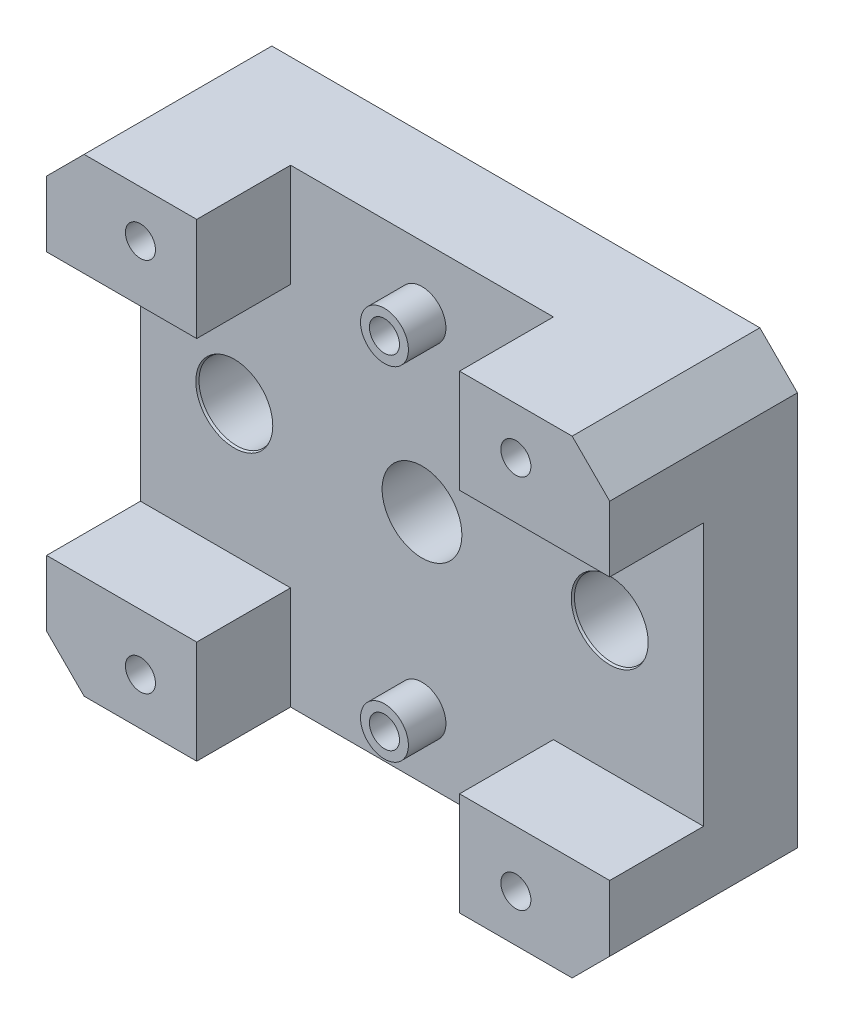
ISO-10303-21;
HEADER;
FILE_DESCRIPTION(('STEP AP214'),'2;1');
FILE_NAME('part.step','',(''),(''),'','','');
FILE_SCHEMA(('AUTOMOTIVE_DESIGN { 1 0 10303 214 1 1 1 1 }'));
ENDSEC;
DATA;
#1=APPLICATION_CONTEXT('core data for automotive mechanical design processes');
#2=APPLICATION_PROTOCOL_DEFINITION('international standard','automotive_design',2000,#1);
#3=PRODUCT_CONTEXT('',#1,'mechanical');
#4=PRODUCT('Part','Part','',(#3));
#5=PRODUCT_RELATED_PRODUCT_CATEGORY('part','',(#4));
#6=PRODUCT_DEFINITION_FORMATION('','',#4);
#7=PRODUCT_DEFINITION_CONTEXT('part definition',#1,'design');
#8=PRODUCT_DEFINITION('design','',#6,#7);
#9=PRODUCT_DEFINITION_SHAPE('','',#8);
#10=(LENGTH_UNIT() NAMED_UNIT(*) SI_UNIT(.MILLI.,.METRE.));
#11=(NAMED_UNIT(*) PLANE_ANGLE_UNIT() SI_UNIT($,.RADIAN.));
#12=(NAMED_UNIT(*) SI_UNIT($,.STERADIAN.) SOLID_ANGLE_UNIT());
#13=UNCERTAINTY_MEASURE_WITH_UNIT(LENGTH_MEASURE(1.E-05),#10,'distance_accuracy_value','');
#14=(GEOMETRIC_REPRESENTATION_CONTEXT(3) GLOBAL_UNCERTAINTY_ASSIGNED_CONTEXT((#13)) GLOBAL_UNIT_ASSIGNED_CONTEXT((#10,
#11,#12)) REPRESENTATION_CONTEXT('',''));
#15=CARTESIAN_POINT('',(0.,0.,0.));
#16=DIRECTION('',(0.,0.,1.));
#17=DIRECTION('',(1.,0.,0.));
#18=AXIS2_PLACEMENT_3D('',#15,#16,#17);
#19=CARTESIAN_POINT('',(0.,0.,0.));
#20=DIRECTION('',(0.,0.,-1.));
#21=DIRECTION('',(-1.,0.,0.));
#22=AXIS2_PLACEMENT_3D('',#19,#20,#21);
#23=PLANE('',#22);
#24=CARTESIAN_POINT('',(-20.,20.0000000000002,0.));
#25=DIRECTION('',(0.,0.,1.));
#26=DIRECTION('',(1.,0.,0.));
#27=AXIS2_PLACEMENT_3D('',#24,#25,#26);
#28=CIRCLE('',#27,1.60000000000001);
#29=CARTESIAN_POINT('',(-18.4,20.0000000000002,0.));
#30=VERTEX_POINT('',#29);
#31=EDGE_CURVE('E970',#30,#30,#28,.T.);
#32=ORIENTED_EDGE('',*,*,#31,.T.);
#33=EDGE_LOOP('',(#32));
#34=FACE_BOUND('',#33,.T.);
#35=CARTESIAN_POINT('',(20.,20.0000000000002,0.));
#36=DIRECTION('',(0.,0.,1.));
#37=DIRECTION('',(1.,0.,0.));
#38=AXIS2_PLACEMENT_3D('',#35,#36,#37);
#39=CIRCLE('',#38,1.60000000000001);
#40=CARTESIAN_POINT('',(21.6,20.0000000000002,0.));
#41=VERTEX_POINT('',#40);
#42=EDGE_CURVE('E964',#41,#41,#39,.T.);
#43=ORIENTED_EDGE('',*,*,#42,.T.);
#44=EDGE_LOOP('',(#43));
#45=FACE_BOUND('',#44,.T.);
#46=CARTESIAN_POINT('',(20.,-20.0000000000002,0.));
#47=DIRECTION('',(0.,0.,1.));
#48=DIRECTION('',(1.,0.,0.));
#49=AXIS2_PLACEMENT_3D('',#46,#47,#48);
#50=CIRCLE('',#49,1.60000000000001);
#51=CARTESIAN_POINT('',(21.6,-20.0000000000002,0.));
#52=VERTEX_POINT('',#51);
#53=EDGE_CURVE('E960',#52,#52,#50,.T.);
#54=ORIENTED_EDGE('',*,*,#53,.T.);
#55=EDGE_LOOP('',(#54));
#56=FACE_BOUND('',#55,.T.);
#57=DIRECTION('',(0.,1.,0.));
#58=VECTOR('',#57,1.);
#59=CARTESIAN_POINT('',(30.,-25.,0.));
#60=LINE('',#59,#58);
#61=CARTESIAN_POINT('',(30.,-21.,0.));
#62=VERTEX_POINT('',#61);
#63=CARTESIAN_POINT('',(30.,21.,0.));
#64=VERTEX_POINT('',#63);
#65=EDGE_CURVE('E386',#62,#64,#60,.T.);
#66=ORIENTED_EDGE('',*,*,#65,.F.);
#67=DIRECTION('',(0.707106781186548,0.707106781186547,0.));
#68=VECTOR('',#67,1.);
#69=CARTESIAN_POINT('',(25.5,-25.5,0.));
#70=LINE('',#69,#68);
#71=CARTESIAN_POINT('',(26.,-25.,0.));
#72=VERTEX_POINT('',#71);
#73=EDGE_CURVE('E435',#62,#72,#70,.F.);
#74=ORIENTED_EDGE('',*,*,#73,.T.);
#75=DIRECTION('',(1.,0.,0.));
#76=VECTOR('',#75,1.);
#77=CARTESIAN_POINT('',(-30.,-25.,0.));
#78=LINE('',#77,#76);
#79=CARTESIAN_POINT('',(-26.,-25.,0.));
#80=VERTEX_POINT('',#79);
#81=EDGE_CURVE('E391',#80,#72,#78,.T.);
#82=ORIENTED_EDGE('',*,*,#81,.F.);
#83=DIRECTION('',(0.707106781186547,-0.707106781186548,0.));
#84=VECTOR('',#83,1.);
#85=CARTESIAN_POINT('',(-25.5,-25.5,0.));
#86=LINE('',#85,#84);
#87=CARTESIAN_POINT('',(-30.,-21.,0.));
#88=VERTEX_POINT('',#87);
#89=EDGE_CURVE('E432',#80,#88,#86,.F.);
#90=ORIENTED_EDGE('',*,*,#89,.T.);
#91=DIRECTION('',(0.,-1.,0.));
#92=VECTOR('',#91,1.);
#93=CARTESIAN_POINT('',(-30.,-25.,0.));
#94=LINE('',#93,#92);
#95=CARTESIAN_POINT('',(-30.,21.,0.));
#96=VERTEX_POINT('',#95);
#97=EDGE_CURVE('E406',#96,#88,#94,.T.);
#98=ORIENTED_EDGE('',*,*,#97,.F.);
#99=DIRECTION('',(-0.707106781186548,-0.707106781186547,0.));
#100=VECTOR('',#99,1.);
#101=CARTESIAN_POINT('',(-25.5,25.5,0.));
#102=LINE('',#101,#100);
#103=CARTESIAN_POINT('',(-26.,25.,0.));
#104=VERTEX_POINT('',#103);
#105=EDGE_CURVE('E429',#96,#104,#102,.F.);
#106=ORIENTED_EDGE('',*,*,#105,.T.);
#107=DIRECTION('',(-1.,0.,0.));
#108=VECTOR('',#107,1.);
#109=CARTESIAN_POINT('',(-30.,25.,0.));
#110=LINE('',#109,#108);
#111=CARTESIAN_POINT('',(26.,25.,0.));
#112=VERTEX_POINT('',#111);
#113=EDGE_CURVE('E403',#112,#104,#110,.T.);
#114=ORIENTED_EDGE('',*,*,#113,.F.);
#115=DIRECTION('',(-0.707106781186546,0.707106781186549,0.));
#116=VECTOR('',#115,1.);
#117=CARTESIAN_POINT('',(25.5,25.5,0.));
#118=LINE('',#117,#116);
#119=EDGE_CURVE('E426',#112,#64,#118,.F.);
#120=ORIENTED_EDGE('',*,*,#119,.T.);
#121=EDGE_LOOP('',(#66,#74,#82,#90,#98,#106,#114,#120));
#122=FACE_BOUND('',#121,.T.);
#123=CARTESIAN_POINT('',(0.,0.,0.));
#124=DIRECTION('',(0.,0.,-1.));
#125=DIRECTION('',(-1.,0.,0.));
#126=AXIS2_PLACEMENT_3D('',#123,#124,#125);
#127=CIRCLE('',#126,4.25000000000001);
#128=CARTESIAN_POINT('',(-4.25000000000001,0.,0.));
#129=VERTEX_POINT('',#128);
#130=EDGE_CURVE('E382',#129,#129,#127,.T.);
#131=ORIENTED_EDGE('',*,*,#130,.F.);
#132=EDGE_LOOP('',(#131));
#133=FACE_BOUND('',#132,.T.);
#134=CARTESIAN_POINT('',(-20.,0.,0.));
#135=DIRECTION('',(0.,0.,1.));
#136=DIRECTION('',(1.,0.,0.));
#137=AXIS2_PLACEMENT_3D('',#134,#135,#136);
#138=CIRCLE('',#137,4.);
#139=CARTESIAN_POINT('',(-16.,0.,0.));
#140=VERTEX_POINT('',#139);
#141=EDGE_CURVE('E374',#140,#140,#138,.T.);
#142=ORIENTED_EDGE('',*,*,#141,.T.);
#143=EDGE_LOOP('',(#142));
#144=FACE_BOUND('',#143,.T.);
#145=CARTESIAN_POINT('',(20.,0.,0.));
#146=DIRECTION('',(0.,0.,1.));
#147=DIRECTION('',(1.,0.,0.));
#148=AXIS2_PLACEMENT_3D('',#145,#146,#147);
#149=CIRCLE('',#148,4.);
#150=CARTESIAN_POINT('',(24.,0.,0.));
#151=VERTEX_POINT('',#150);
#152=EDGE_CURVE('E362',#151,#151,#149,.T.);
#153=ORIENTED_EDGE('',*,*,#152,.T.);
#154=EDGE_LOOP('',(#153));
#155=FACE_BOUND('',#154,.T.);
#156=CARTESIAN_POINT('',(0.,-18.25,0.));
#157=DIRECTION('',(0.,0.,1.));
#158=DIRECTION('',(1.,0.,0.));
#159=AXIS2_PLACEMENT_3D('',#156,#157,#158);
#160=CIRCLE('',#159,1.60000000000001);
#161=CARTESIAN_POINT('',(1.60000000000001,-18.25,0.));
#162=VERTEX_POINT('',#161);
#163=EDGE_CURVE('E342',#162,#162,#160,.T.);
#164=ORIENTED_EDGE('',*,*,#163,.T.);
#165=EDGE_LOOP('',(#164));
#166=FACE_BOUND('',#165,.T.);
#167=CARTESIAN_POINT('',(0.,18.25,0.));
#168=DIRECTION('',(0.,0.,1.));
#169=DIRECTION('',(1.,0.,0.));
#170=AXIS2_PLACEMENT_3D('',#167,#168,#169);
#171=CIRCLE('',#170,1.60000000000001);
#172=CARTESIAN_POINT('',(1.60000000000001,18.25,0.));
#173=VERTEX_POINT('',#172);
#174=EDGE_CURVE('E334',#173,#173,#171,.T.);
#175=ORIENTED_EDGE('',*,*,#174,.T.);
#176=EDGE_LOOP('',(#175));
#177=FACE_BOUND('',#176,.T.);
#178=CARTESIAN_POINT('',(-20.,-20.0000000000002,0.));
#179=DIRECTION('',(0.,0.,1.));
#180=DIRECTION('',(1.,0.,0.));
#181=AXIS2_PLACEMENT_3D('',#178,#179,#180);
#182=CIRCLE('',#181,1.60000000000001);
#183=CARTESIAN_POINT('',(-18.4,-20.0000000000002,0.));
#184=VERTEX_POINT('',#183);
#185=EDGE_CURVE('E516',#184,#184,#182,.T.);
#186=ORIENTED_EDGE('',*,*,#185,.T.);
#187=EDGE_LOOP('',(#186));
#188=FACE_BOUND('',#187,.T.);
#189=ADVANCED_FACE('F43',(#34,#45,#56,#122,#133,#144,#155,#166,#177,#188),#23,.T.);
#190=CARTESIAN_POINT('',(0.,0.,10.));
#191=DIRECTION('',(0.,0.,-1.));
#192=DIRECTION('',(-1.,0.,0.));
#193=AXIS2_PLACEMENT_3D('',#190,#191,#192);
#194=PLANE('',#193);
#195=CARTESIAN_POINT('',(0.,-18.25,10.));
#196=DIRECTION('',(0.,0.,-1.));
#197=DIRECTION('',(-1.,0.,0.));
#198=AXIS2_PLACEMENT_3D('',#195,#196,#197);
#199=CIRCLE('',#198,2.55);
#200=CARTESIAN_POINT('',(-2.55,-18.25,10.));
#201=VERTEX_POINT('',#200);
#202=EDGE_CURVE('E415',#201,#201,#199,.F.);
#203=ORIENTED_EDGE('',*,*,#202,.F.);
#204=EDGE_LOOP('',(#203));
#205=FACE_BOUND('',#204,.T.);
#206=CARTESIAN_POINT('',(0.,18.25,10.));
#207=DIRECTION('',(0.,0.,-1.));
#208=DIRECTION('',(-1.,0.,0.));
#209=AXIS2_PLACEMENT_3D('',#206,#207,#208);
#210=CIRCLE('',#209,2.55);
#211=CARTESIAN_POINT('',(-2.55,18.25,10.));
#212=VERTEX_POINT('',#211);
#213=EDGE_CURVE('E399',#212,#212,#210,.F.);
#214=ORIENTED_EDGE('',*,*,#213,.F.);
#215=EDGE_LOOP('',(#214));
#216=FACE_BOUND('',#215,.T.);
#217=CARTESIAN_POINT('',(20.,0.,10.));
#218=DIRECTION('',(0.,0.,1.));
#219=DIRECTION('',(1.,0.,0.));
#220=AXIS2_PLACEMENT_3D('',#217,#218,#219);
#221=CIRCLE('',#220,4.1);
#222=CARTESIAN_POINT('',(24.1,0.,10.));
#223=VERTEX_POINT('',#222);
#224=EDGE_CURVE('E354',#223,#223,#221,.T.);
#225=ORIENTED_EDGE('',*,*,#224,.F.);
#226=EDGE_LOOP('',(#225));
#227=FACE_BOUND('',#226,.T.);
#228=CARTESIAN_POINT('',(-20.,0.,10.));
#229=DIRECTION('',(0.,0.,1.));
#230=DIRECTION('',(1.,0.,0.));
#231=AXIS2_PLACEMENT_3D('',#228,#229,#230);
#232=CIRCLE('',#231,4.1);
#233=CARTESIAN_POINT('',(-15.9,0.,10.));
#234=VERTEX_POINT('',#233);
#235=EDGE_CURVE('E366',#234,#234,#232,.T.);
#236=ORIENTED_EDGE('',*,*,#235,.F.);
#237=EDGE_LOOP('',(#236));
#238=FACE_BOUND('',#237,.T.);
#239=CARTESIAN_POINT('',(0.,0.,10.));
#240=DIRECTION('',(0.,0.,1.));
#241=DIRECTION('',(1.,0.,0.));
#242=AXIS2_PLACEMENT_3D('',#239,#240,#241);
#243=CIRCLE('',#242,4.25000000000002);
#244=CARTESIAN_POINT('',(4.25000000000002,0.,10.));
#245=VERTEX_POINT('',#244);
#246=EDGE_CURVE('E378',#245,#245,#243,.T.);
#247=ORIENTED_EDGE('',*,*,#246,.F.);
#248=EDGE_LOOP('',(#247));
#249=FACE_BOUND('',#248,.T.);
#250=DIRECTION('',(0.,1.,0.));
#251=VECTOR('',#250,1.);
#252=CARTESIAN_POINT('',(-14.0026876195789,0.,10.));
#253=LINE('',#252,#251);
#254=CARTESIAN_POINT('',(-14.0026876195789,-25.,10.));
#255=VERTEX_POINT('',#254);
#256=CARTESIAN_POINT('',(-14.0026876195789,-14.002687619579,10.));
#257=VERTEX_POINT('',#256);
#258=EDGE_CURVE('E513',#255,#257,#253,.T.);
#259=ORIENTED_EDGE('',*,*,#258,.F.);
#260=DIRECTION('',(1.,0.,0.));
#261=VECTOR('',#260,1.);
#262=CARTESIAN_POINT('',(-30.,-25.,10.));
#263=LINE('',#262,#261);
#264=CARTESIAN_POINT('',(14.0026876195789,-25.,10.));
#265=VERTEX_POINT('',#264);
#266=EDGE_CURVE('E213',#255,#265,#263,.T.);
#267=ORIENTED_EDGE('',*,*,#266,.T.);
#268=DIRECTION('',(0.,1.,0.));
#269=VECTOR('',#268,1.);
#270=CARTESIAN_POINT('',(14.0026876195789,0.,10.));
#271=LINE('',#270,#269);
#272=CARTESIAN_POINT('',(14.0026876195789,-14.002687619579,10.));
#273=VERTEX_POINT('',#272);
#274=EDGE_CURVE('E221',#265,#273,#271,.T.);
#275=ORIENTED_EDGE('',*,*,#274,.T.);
#276=DIRECTION('',(-1.,0.,0.));
#277=VECTOR('',#276,1.);
#278=CARTESIAN_POINT('',(0.,-14.002687619579,10.));
#279=LINE('',#278,#277);
#280=CARTESIAN_POINT('',(30.,-14.002687619579,10.));
#281=VERTEX_POINT('',#280);
#282=EDGE_CURVE('E216',#281,#273,#279,.T.);
#283=ORIENTED_EDGE('',*,*,#282,.F.);
#284=DIRECTION('',(0.,1.,0.));
#285=VECTOR('',#284,1.);
#286=CARTESIAN_POINT('',(30.,-25.,10.));
#287=LINE('',#286,#285);
#288=CARTESIAN_POINT('',(30.,14.002687619579,10.));
#289=VERTEX_POINT('',#288);
#290=EDGE_CURVE('E387',#281,#289,#287,.T.);
#291=ORIENTED_EDGE('',*,*,#290,.T.);
#292=DIRECTION('',(-1.,0.,0.));
#293=VECTOR('',#292,1.);
#294=CARTESIAN_POINT('',(0.,14.002687619579,10.));
#295=LINE('',#294,#293);
#296=CARTESIAN_POINT('',(14.0026876195789,14.002687619579,10.));
#297=VERTEX_POINT('',#296);
#298=EDGE_CURVE('E263',#289,#297,#295,.T.);
#299=ORIENTED_EDGE('',*,*,#298,.T.);
#300=DIRECTION('',(0.,-1.,0.));
#301=VECTOR('',#300,1.);
#302=CARTESIAN_POINT('',(14.0026876195789,0.,10.));
#303=LINE('',#302,#301);
#304=CARTESIAN_POINT('',(14.0026876195789,25.,10.));
#305=VERTEX_POINT('',#304);
#306=EDGE_CURVE('E258',#305,#297,#303,.T.);
#307=ORIENTED_EDGE('',*,*,#306,.F.);
#308=DIRECTION('',(-1.,0.,0.));
#309=VECTOR('',#308,1.);
#310=CARTESIAN_POINT('',(-30.,25.,10.));
#311=LINE('',#310,#309);
#312=CARTESIAN_POINT('',(-14.0026876195789,25.,10.));
#313=VERTEX_POINT('',#312);
#314=EDGE_CURVE('E390',#305,#313,#311,.T.);
#315=ORIENTED_EDGE('',*,*,#314,.T.);
#316=DIRECTION('',(0.,-1.,0.));
#317=VECTOR('',#316,1.);
#318=CARTESIAN_POINT('',(-14.0026876195789,0.,10.));
#319=LINE('',#318,#317);
#320=CARTESIAN_POINT('',(-14.0026876195789,14.0026876195791,10.));
#321=VERTEX_POINT('',#320);
#322=EDGE_CURVE('E294',#313,#321,#319,.T.);
#323=ORIENTED_EDGE('',*,*,#322,.T.);
#324=DIRECTION('',(1.,0.,0.));
#325=VECTOR('',#324,1.);
#326=CARTESIAN_POINT('',(0.,14.0026876195791,10.));
#327=LINE('',#326,#325);
#328=CARTESIAN_POINT('',(-30.,14.002687619579,10.));
#329=VERTEX_POINT('',#328);
#330=EDGE_CURVE('E300',#329,#321,#327,.T.);
#331=ORIENTED_EDGE('',*,*,#330,.F.);
#332=DIRECTION('',(0.,-1.,0.));
#333=VECTOR('',#332,1.);
#334=CARTESIAN_POINT('',(-30.,-25.,10.));
#335=LINE('',#334,#333);
#336=CARTESIAN_POINT('',(-30.,-14.002687619579,10.));
#337=VERTEX_POINT('',#336);
#338=EDGE_CURVE('E394',#329,#337,#335,.T.);
#339=ORIENTED_EDGE('',*,*,#338,.T.);
#340=DIRECTION('',(1.,0.,0.));
#341=VECTOR('',#340,1.);
#342=CARTESIAN_POINT('',(0.,-14.002687619579,10.));
#343=LINE('',#342,#341);
#344=EDGE_CURVE('E197',#337,#257,#343,.T.);
#345=ORIENTED_EDGE('',*,*,#344,.T.);
#346=EDGE_LOOP('',(#259,#267,#275,#283,#291,#299,#307,#315,#323,#331,#339,#345));
#347=FACE_BOUND('',#346,.T.);
#348=ADVANCED_FACE('F523',(#205,#216,#227,#238,#249,#347),#194,.F.);
#349=CARTESIAN_POINT('',(30.,-25.,10.));
#350=DIRECTION('',(-1.,0.,0.));
#351=DIRECTION('',(0.,0.,1.));
#352=AXIS2_PLACEMENT_3D('',#349,#350,#351);
#353=PLANE('',#352);
#354=DIRECTION('',(0.,1.,0.));
#355=VECTOR('',#354,1.);
#356=CARTESIAN_POINT('',(30.,0.,20.));
#357=LINE('',#356,#355);
#358=CARTESIAN_POINT('',(30.,-21.,20.));
#359=VERTEX_POINT('',#358);
#360=CARTESIAN_POINT('',(30.,-14.002687619579,20.));
#361=VERTEX_POINT('',#360);
#362=EDGE_CURVE('E231',#359,#361,#357,.T.);
#363=ORIENTED_EDGE('',*,*,#362,.F.);
#364=DIRECTION('',(0.,0.,-1.));
#365=VECTOR('',#364,1.);
#366=CARTESIAN_POINT('',(30.,-21.,10.));
#367=LINE('',#366,#365);
#368=EDGE_CURVE('E422',#359,#62,#367,.T.);
#369=ORIENTED_EDGE('',*,*,#368,.T.);
#370=ORIENTED_EDGE('',*,*,#65,.T.);
#371=DIRECTION('',(0.,0.,1.));
#372=VECTOR('',#371,1.);
#373=CARTESIAN_POINT('',(30.,21.,10.));
#374=LINE('',#373,#372);
#375=CARTESIAN_POINT('',(30.,21.,20.));
#376=VERTEX_POINT('',#375);
#377=EDGE_CURVE('E419',#64,#376,#374,.T.);
#378=ORIENTED_EDGE('',*,*,#377,.T.);
#379=DIRECTION('',(0.,1.,0.));
#380=VECTOR('',#379,1.);
#381=CARTESIAN_POINT('',(30.,0.,20.));
#382=LINE('',#381,#380);
#383=CARTESIAN_POINT('',(30.,14.002687619579,20.));
#384=VERTEX_POINT('',#383);
#385=EDGE_CURVE('E270',#384,#376,#382,.T.);
#386=ORIENTED_EDGE('',*,*,#385,.F.);
#387=DIRECTION('',(0.,0.,-1.));
#388=VECTOR('',#387,1.);
#389=CARTESIAN_POINT('',(30.,14.002687619579,20.));
#390=LINE('',#389,#388);
#391=EDGE_CURVE('E277',#384,#289,#390,.T.);
#392=ORIENTED_EDGE('',*,*,#391,.T.);
#393=ORIENTED_EDGE('',*,*,#290,.F.);
#394=DIRECTION('',(0.,0.,-1.));
#395=VECTOR('',#394,1.);
#396=CARTESIAN_POINT('',(30.,-14.002687619579,20.));
#397=LINE('',#396,#395);
#398=EDGE_CURVE('E254',#361,#281,#397,.T.);
#399=ORIENTED_EDGE('',*,*,#398,.F.);
#400=EDGE_LOOP('',(#363,#369,#370,#378,#386,#392,#393,#399));
#401=FACE_BOUND('',#400,.T.);
#402=ADVANCED_FACE('F488',(#401),#353,.F.);
#403=CARTESIAN_POINT('',(-30.,25.,10.));
#404=DIRECTION('',(0.,-1.,0.));
#405=DIRECTION('',(0.,0.,-1.));
#406=AXIS2_PLACEMENT_3D('',#403,#404,#405);
#407=PLANE('',#406);
#408=ORIENTED_EDGE('',*,*,#113,.T.);
#409=DIRECTION('',(0.,0.,1.));
#410=VECTOR('',#409,1.);
#411=CARTESIAN_POINT('',(-26.,25.,10.));
#412=LINE('',#411,#410);
#413=CARTESIAN_POINT('',(-26.,25.,20.));
#414=VERTEX_POINT('',#413);
#415=EDGE_CURVE('E66',#104,#414,#412,.T.);
#416=ORIENTED_EDGE('',*,*,#415,.T.);
#417=DIRECTION('',(-1.,0.,0.));
#418=VECTOR('',#417,1.);
#419=CARTESIAN_POINT('',(0.,25.,20.));
#420=LINE('',#419,#418);
#421=CARTESIAN_POINT('',(-14.0026876195789,25.,20.));
#422=VERTEX_POINT('',#421);
#423=EDGE_CURVE('E299',#422,#414,#420,.T.);
#424=ORIENTED_EDGE('',*,*,#423,.F.);
#425=DIRECTION('',(0.,0.,-1.));
#426=VECTOR('',#425,1.);
#427=CARTESIAN_POINT('',(-14.0026876195789,25.,20.));
#428=LINE('',#427,#426);
#429=EDGE_CURVE('E326',#422,#313,#428,.T.);
#430=ORIENTED_EDGE('',*,*,#429,.T.);
#431=ORIENTED_EDGE('',*,*,#314,.F.);
#432=DIRECTION('',(0.,0.,-1.));
#433=VECTOR('',#432,1.);
#434=CARTESIAN_POINT('',(14.0026876195789,25.,20.));
#435=LINE('',#434,#433);
#436=CARTESIAN_POINT('',(14.0026876195789,25.,20.));
#437=VERTEX_POINT('',#436);
#438=EDGE_CURVE('E290',#437,#305,#435,.T.);
#439=ORIENTED_EDGE('',*,*,#438,.F.);
#440=DIRECTION('',(-1.,0.,0.));
#441=VECTOR('',#440,1.);
#442=CARTESIAN_POINT('',(0.,25.,20.));
#443=LINE('',#442,#441);
#444=CARTESIAN_POINT('',(26.,25.,20.));
#445=VERTEX_POINT('',#444);
#446=EDGE_CURVE('E259',#445,#437,#443,.T.);
#447=ORIENTED_EDGE('',*,*,#446,.F.);
#448=DIRECTION('',(0.,0.,-1.));
#449=VECTOR('',#448,1.);
#450=CARTESIAN_POINT('',(26.,25.,10.));
#451=LINE('',#450,#449);
#452=EDGE_CURVE('E456',#445,#112,#451,.T.);
#453=ORIENTED_EDGE('',*,*,#452,.T.);
#454=EDGE_LOOP('',(#408,#416,#424,#430,#431,#439,#447,#453));
#455=FACE_BOUND('',#454,.T.);
#456=ADVANCED_FACE('F481',(#455),#407,.F.);
#457=CARTESIAN_POINT('',(-30.,-25.,10.));
#458=DIRECTION('',(1.,0.,0.));
#459=DIRECTION('',(0.,0.,-1.));
#460=AXIS2_PLACEMENT_3D('',#457,#458,#459);
#461=PLANE('',#460);
#462=ORIENTED_EDGE('',*,*,#97,.T.);
#463=DIRECTION('',(0.,0.,1.));
#464=VECTOR('',#463,1.);
#465=CARTESIAN_POINT('',(-30.,-21.,10.));
#466=LINE('',#465,#464);
#467=CARTESIAN_POINT('',(-30.,-21.,20.));
#468=VERTEX_POINT('',#467);
#469=EDGE_CURVE('E451',#88,#468,#466,.T.);
#470=ORIENTED_EDGE('',*,*,#469,.T.);
#471=DIRECTION('',(0.,-1.,0.));
#472=VECTOR('',#471,1.);
#473=CARTESIAN_POINT('',(-30.,0.,20.));
#474=LINE('',#473,#472);
#475=CARTESIAN_POINT('',(-30.,-14.002687619579,20.));
#476=VERTEX_POINT('',#475);
#477=EDGE_CURVE('E503',#476,#468,#474,.T.);
#478=ORIENTED_EDGE('',*,*,#477,.F.);
#479=DIRECTION('',(0.,0.,-1.));
#480=VECTOR('',#479,1.);
#481=CARTESIAN_POINT('',(-30.,-14.002687619579,20.));
#482=LINE('',#481,#480);
#483=EDGE_CURVE('E223',#476,#337,#482,.T.);
#484=ORIENTED_EDGE('',*,*,#483,.T.);
#485=ORIENTED_EDGE('',*,*,#338,.F.);
#486=DIRECTION('',(0.,0.,-1.));
#487=VECTOR('',#486,1.);
#488=CARTESIAN_POINT('',(-30.,14.002687619579,20.));
#489=LINE('',#488,#487);
#490=CARTESIAN_POINT('',(-30.,14.002687619579,20.));
#491=VERTEX_POINT('',#490);
#492=EDGE_CURVE('E322',#491,#329,#489,.T.);
#493=ORIENTED_EDGE('',*,*,#492,.F.);
#494=DIRECTION('',(0.,-1.,0.));
#495=VECTOR('',#494,1.);
#496=CARTESIAN_POINT('',(-30.,0.,20.));
#497=LINE('',#496,#495);
#498=CARTESIAN_POINT('',(-30.,21.,20.));
#499=VERTEX_POINT('',#498);
#500=EDGE_CURVE('E303',#499,#491,#497,.T.);
#501=ORIENTED_EDGE('',*,*,#500,.F.);
#502=DIRECTION('',(0.,0.,-1.));
#503=VECTOR('',#502,1.);
#504=CARTESIAN_POINT('',(-30.,21.,10.));
#505=LINE('',#504,#503);
#506=EDGE_CURVE('E447',#499,#96,#505,.T.);
#507=ORIENTED_EDGE('',*,*,#506,.T.);
#508=EDGE_LOOP('',(#462,#470,#478,#484,#485,#493,#501,#507));
#509=FACE_BOUND('',#508,.T.);
#510=ADVANCED_FACE('F472',(#509),#461,.F.);
#511=CARTESIAN_POINT('',(-30.,-25.,10.));
#512=DIRECTION('',(0.,1.,0.));
#513=DIRECTION('',(0.,0.,1.));
#514=AXIS2_PLACEMENT_3D('',#511,#512,#513);
#515=PLANE('',#514);
#516=ORIENTED_EDGE('',*,*,#81,.T.);
#517=DIRECTION('',(0.,0.,1.));
#518=VECTOR('',#517,1.);
#519=CARTESIAN_POINT('',(26.,-25.,10.));
#520=LINE('',#519,#518);
#521=CARTESIAN_POINT('',(26.,-25.,20.));
#522=VERTEX_POINT('',#521);
#523=EDGE_CURVE('E441',#72,#522,#520,.T.);
#524=ORIENTED_EDGE('',*,*,#523,.T.);
#525=DIRECTION('',(1.,0.,0.));
#526=VECTOR('',#525,1.);
#527=CARTESIAN_POINT('',(0.,-25.,20.));
#528=LINE('',#527,#526);
#529=CARTESIAN_POINT('',(14.0026876195789,-25.,20.));
#530=VERTEX_POINT('',#529);
#531=EDGE_CURVE('E241',#530,#522,#528,.T.);
#532=ORIENTED_EDGE('',*,*,#531,.F.);
#533=DIRECTION('',(0.,0.,-1.));
#534=VECTOR('',#533,1.);
#535=CARTESIAN_POINT('',(14.0026876195789,-25.,20.));
#536=LINE('',#535,#534);
#537=EDGE_CURVE('E244',#530,#265,#536,.T.);
#538=ORIENTED_EDGE('',*,*,#537,.T.);
#539=ORIENTED_EDGE('',*,*,#266,.F.);
#540=DIRECTION('',(0.,0.,-1.));
#541=VECTOR('',#540,1.);
#542=CARTESIAN_POINT('',(-14.0026876195789,-25.,20.));
#543=LINE('',#542,#541);
#544=CARTESIAN_POINT('',(-14.0026876195789,-25.,20.));
#545=VERTEX_POINT('',#544);
#546=EDGE_CURVE('E203',#545,#255,#543,.T.);
#547=ORIENTED_EDGE('',*,*,#546,.F.);
#548=DIRECTION('',(1.,0.,0.));
#549=VECTOR('',#548,1.);
#550=CARTESIAN_POINT('',(0.,-25.,20.));
#551=LINE('',#550,#549);
#552=CARTESIAN_POINT('',(-26.,-25.,20.));
#553=VERTEX_POINT('',#552);
#554=EDGE_CURVE('E182',#553,#545,#551,.T.);
#555=ORIENTED_EDGE('',*,*,#554,.F.);
#556=DIRECTION('',(0.,0.,-1.));
#557=VECTOR('',#556,1.);
#558=CARTESIAN_POINT('',(-26.,-25.,10.));
#559=LINE('',#558,#557);
#560=EDGE_CURVE('E438',#553,#80,#559,.T.);
#561=ORIENTED_EDGE('',*,*,#560,.T.);
#562=EDGE_LOOP('',(#516,#524,#532,#538,#539,#547,#555,#561));
#563=FACE_BOUND('',#562,.T.);
#564=ADVANCED_FACE('F211',(#563),#515,.F.);
#565=CARTESIAN_POINT('',(0.,0.,10.));
#566=DIRECTION('',(0.,0.,1.));
#567=DIRECTION('',(1.,0.,0.));
#568=AXIS2_PLACEMENT_3D('',#565,#566,#567);
#569=CYLINDRICAL_SURFACE('',#568,4.25000000000001);
#570=ORIENTED_EDGE('',*,*,#130,.T.);
#571=EDGE_LOOP('',(#570));
#572=FACE_BOUND('',#571,.T.);
#573=ORIENTED_EDGE('',*,*,#246,.T.);
#574=EDGE_LOOP('',(#573));
#575=FACE_BOUND('',#574,.T.);
#576=ADVANCED_FACE('F577',(#572,#575),#569,.F.);
#577=CARTESIAN_POINT('',(-20.,0.,10.));
#578=DIRECTION('',(0.,0.,1.));
#579=DIRECTION('',(1.,0.,0.));
#580=AXIS2_PLACEMENT_3D('',#577,#578,#579);
#581=CYLINDRICAL_SURFACE('',#580,4.00000000000001);
#582=ORIENTED_EDGE('',*,*,#141,.F.);
#583=EDGE_LOOP('',(#582));
#584=FACE_BOUND('',#583,.T.);
#585=CARTESIAN_POINT('',(-20.,0.,9.75857864376273));
#586=DIRECTION('',(0.,0.,1.));
#587=DIRECTION('',(1.,0.,0.));
#588=AXIS2_PLACEMENT_3D('',#585,#586,#587);
#589=CIRCLE('',#588,4.00000000000001);
#590=CARTESIAN_POINT('',(-16.,0.,9.75857864376273));
#591=VERTEX_POINT('',#590);
#592=EDGE_CURVE('E370',#591,#591,#589,.T.);
#593=ORIENTED_EDGE('',*,*,#592,.T.);
#594=EDGE_LOOP('',(#593));
#595=FACE_BOUND('',#594,.T.);
#596=ADVANCED_FACE('F882',(#584,#595),#581,.F.);
#597=CARTESIAN_POINT('',(-20.,0.,10.));
#598=DIRECTION('',(0.,0.,1.));
#599=DIRECTION('',(1.,0.,0.));
#600=AXIS2_PLACEMENT_3D('',#597,#598,#599);
#601=CONICAL_SURFACE('',#600,4.1,0.392699081698732);
#602=ORIENTED_EDGE('',*,*,#592,.F.);
#603=EDGE_LOOP('',(#602));
#604=FACE_BOUND('',#603,.T.);
#605=ORIENTED_EDGE('',*,*,#235,.T.);
#606=EDGE_LOOP('',(#605));
#607=FACE_BOUND('',#606,.T.);
#608=ADVANCED_FACE('F872',(#604,#607),#601,.F.);
#609=CARTESIAN_POINT('',(20.,0.,10.));
#610=DIRECTION('',(0.,0.,1.));
#611=DIRECTION('',(1.,0.,0.));
#612=AXIS2_PLACEMENT_3D('',#609,#610,#611);
#613=CYLINDRICAL_SURFACE('',#612,4.00000000000001);
#614=ORIENTED_EDGE('',*,*,#152,.F.);
#615=EDGE_LOOP('',(#614));
#616=FACE_BOUND('',#615,.T.);
#617=CARTESIAN_POINT('',(20.,0.,9.75857864376273));
#618=DIRECTION('',(0.,0.,1.));
#619=DIRECTION('',(1.,0.,0.));
#620=AXIS2_PLACEMENT_3D('',#617,#618,#619);
#621=CIRCLE('',#620,4.00000000000001);
#622=CARTESIAN_POINT('',(24.,0.,9.75857864376273));
#623=VERTEX_POINT('',#622);
#624=EDGE_CURVE('E358',#623,#623,#621,.T.);
#625=ORIENTED_EDGE('',*,*,#624,.T.);
#626=EDGE_LOOP('',(#625));
#627=FACE_BOUND('',#626,.T.);
#628=ADVANCED_FACE('F862',(#616,#627),#613,.F.);
#629=CARTESIAN_POINT('',(20.,0.,10.));
#630=DIRECTION('',(0.,0.,1.));
#631=DIRECTION('',(1.,0.,0.));
#632=AXIS2_PLACEMENT_3D('',#629,#630,#631);
#633=CONICAL_SURFACE('',#632,4.1,0.392699081698732);
#634=ORIENTED_EDGE('',*,*,#624,.F.);
#635=EDGE_LOOP('',(#634));
#636=FACE_BOUND('',#635,.T.);
#637=ORIENTED_EDGE('',*,*,#224,.T.);
#638=EDGE_LOOP('',(#637));
#639=FACE_BOUND('',#638,.T.);
#640=ADVANCED_FACE('F852',(#636,#639),#633,.F.);
#641=CARTESIAN_POINT('',(0.,18.25,14.));
#642=DIRECTION('',(0.,0.,-1.));
#643=DIRECTION('',(-1.,0.,0.));
#644=AXIS2_PLACEMENT_3D('',#641,#642,#643);
#645=CYLINDRICAL_SURFACE('',#644,2.55);
#646=CARTESIAN_POINT('',(0.,18.25,14.));
#647=DIRECTION('',(0.,0.,1.));
#648=DIRECTION('',(1.,0.,0.));
#649=AXIS2_PLACEMENT_3D('',#646,#647,#648);
#650=CIRCLE('',#649,2.55);
#651=CARTESIAN_POINT('',(2.55,18.25,14.));
#652=VERTEX_POINT('',#651);
#653=EDGE_CURVE('E350',#652,#652,#650,.T.);
#654=ORIENTED_EDGE('',*,*,#653,.F.);
#655=EDGE_LOOP('',(#654));
#656=FACE_BOUND('',#655,.T.);
#657=ORIENTED_EDGE('',*,*,#213,.T.);
#658=EDGE_LOOP('',(#657));
#659=FACE_BOUND('',#658,.T.);
#660=ADVANCED_FACE('F835',(#656,#659),#645,.T.);
#661=CARTESIAN_POINT('',(0.,18.25,14.));
#662=DIRECTION('',(0.,0.,1.));
#663=DIRECTION('',(1.,0.,0.));
#664=AXIS2_PLACEMENT_3D('',#661,#662,#663);
#665=PLANE('',#664);
#666=CARTESIAN_POINT('',(0.,18.25,14.));
#667=DIRECTION('',(0.,0.,1.));
#668=DIRECTION('',(1.,0.,0.));
#669=AXIS2_PLACEMENT_3D('',#666,#667,#668);
#670=CIRCLE('',#669,1.60000000000001);
#671=CARTESIAN_POINT('',(1.60000000000001,18.25,14.));
#672=VERTEX_POINT('',#671);
#673=EDGE_CURVE('E330',#672,#672,#670,.T.);
#674=ORIENTED_EDGE('',*,*,#673,.F.);
#675=EDGE_LOOP('',(#674));
#676=FACE_BOUND('',#675,.T.);
#677=ORIENTED_EDGE('',*,*,#653,.T.);
#678=EDGE_LOOP('',(#677));
#679=FACE_BOUND('',#678,.T.);
#680=ADVANCED_FACE('F830',(#676,#679),#665,.T.);
#681=CARTESIAN_POINT('',(0.,-18.25,14.));
#682=DIRECTION('',(0.,0.,-1.));
#683=DIRECTION('',(-1.,0.,0.));
#684=AXIS2_PLACEMENT_3D('',#681,#682,#683);
#685=CYLINDRICAL_SURFACE('',#684,2.55);
#686=CARTESIAN_POINT('',(0.,-18.25,14.));
#687=DIRECTION('',(0.,0.,1.));
#688=DIRECTION('',(1.,0.,0.));
#689=AXIS2_PLACEMENT_3D('',#686,#687,#688);
#690=CIRCLE('',#689,2.55);
#691=CARTESIAN_POINT('',(2.55,-18.25,14.));
#692=VERTEX_POINT('',#691);
#693=EDGE_CURVE('E346',#692,#692,#690,.T.);
#694=ORIENTED_EDGE('',*,*,#693,.F.);
#695=EDGE_LOOP('',(#694));
#696=FACE_BOUND('',#695,.T.);
#697=ORIENTED_EDGE('',*,*,#202,.T.);
#698=EDGE_LOOP('',(#697));
#699=FACE_BOUND('',#698,.T.);
#700=ADVANCED_FACE('F822',(#696,#699),#685,.T.);
#701=CARTESIAN_POINT('',(0.,-18.25,14.));
#702=DIRECTION('',(0.,0.,1.));
#703=DIRECTION('',(1.,0.,0.));
#704=AXIS2_PLACEMENT_3D('',#701,#702,#703);
#705=PLANE('',#704);
#706=CARTESIAN_POINT('',(0.,-18.25,14.));
#707=DIRECTION('',(0.,0.,1.));
#708=DIRECTION('',(1.,0.,0.));
#709=AXIS2_PLACEMENT_3D('',#706,#707,#708);
#710=CIRCLE('',#709,1.60000000000001);
#711=CARTESIAN_POINT('',(1.60000000000001,-18.25,14.));
#712=VERTEX_POINT('',#711);
#713=EDGE_CURVE('E338',#712,#712,#710,.T.);
#714=ORIENTED_EDGE('',*,*,#713,.F.);
#715=EDGE_LOOP('',(#714));
#716=FACE_BOUND('',#715,.T.);
#717=ORIENTED_EDGE('',*,*,#693,.T.);
#718=EDGE_LOOP('',(#717));
#719=FACE_BOUND('',#718,.T.);
#720=ADVANCED_FACE('F812',(#716,#719),#705,.T.);
#721=CARTESIAN_POINT('',(0.,-18.25,14.));
#722=DIRECTION('',(0.,0.,1.));
#723=DIRECTION('',(1.,0.,0.));
#724=AXIS2_PLACEMENT_3D('',#721,#722,#723);
#725=CYLINDRICAL_SURFACE('',#724,1.60000000000001);
#726=ORIENTED_EDGE('',*,*,#163,.F.);
#727=EDGE_LOOP('',(#726));
#728=FACE_BOUND('',#727,.T.);
#729=ORIENTED_EDGE('',*,*,#713,.T.);
#730=EDGE_LOOP('',(#729));
#731=FACE_BOUND('',#730,.T.);
#732=ADVANCED_FACE('F802',(#728,#731),#725,.F.);
#733=CARTESIAN_POINT('',(0.,18.25,14.));
#734=DIRECTION('',(0.,0.,1.));
#735=DIRECTION('',(1.,0.,0.));
#736=AXIS2_PLACEMENT_3D('',#733,#734,#735);
#737=CYLINDRICAL_SURFACE('',#736,1.60000000000001);
#738=ORIENTED_EDGE('',*,*,#174,.F.);
#739=EDGE_LOOP('',(#738));
#740=FACE_BOUND('',#739,.T.);
#741=ORIENTED_EDGE('',*,*,#673,.T.);
#742=EDGE_LOOP('',(#741));
#743=FACE_BOUND('',#742,.T.);
#744=ADVANCED_FACE('F786',(#740,#743),#737,.F.);
#745=CARTESIAN_POINT('',(-14.0026876195789,0.,20.));
#746=DIRECTION('',(1.,0.,0.));
#747=DIRECTION('',(0.,1.,0.));
#748=AXIS2_PLACEMENT_3D('',#745,#746,#747);
#749=PLANE('',#748);
#750=ORIENTED_EDGE('',*,*,#322,.F.);
#751=ORIENTED_EDGE('',*,*,#429,.F.);
#752=DIRECTION('',(0.,-1.,0.));
#753=VECTOR('',#752,1.);
#754=CARTESIAN_POINT('',(-14.0026876195789,0.,20.));
#755=LINE('',#754,#753);
#756=CARTESIAN_POINT('',(-14.0026876195789,14.0026876195791,20.));
#757=VERTEX_POINT('',#756);
#758=EDGE_CURVE('E295',#422,#757,#755,.T.);
#759=ORIENTED_EDGE('',*,*,#758,.T.);
#760=DIRECTION('',(0.,0.,-1.));
#761=VECTOR('',#760,1.);
#762=CARTESIAN_POINT('',(-14.0026876195789,14.0026876195791,20.));
#763=LINE('',#762,#761);
#764=EDGE_CURVE('E313',#757,#321,#763,.T.);
#765=ORIENTED_EDGE('',*,*,#764,.T.);
#766=EDGE_LOOP('',(#750,#751,#759,#765));
#767=FACE_BOUND('',#766,.T.);
#768=ADVANCED_FACE('F529',(#767),#749,.T.);
#769=CARTESIAN_POINT('',(0.,14.0026876195791,20.));
#770=DIRECTION('',(0.,1.,0.));
#771=DIRECTION('',(-1.,0.,0.));
#772=AXIS2_PLACEMENT_3D('',#769,#770,#771);
#773=PLANE('',#772);
#774=ORIENTED_EDGE('',*,*,#330,.T.);
#775=ORIENTED_EDGE('',*,*,#764,.F.);
#776=DIRECTION('',(1.,0.,0.));
#777=VECTOR('',#776,1.);
#778=CARTESIAN_POINT('',(0.,14.0026876195791,20.));
#779=LINE('',#778,#777);
#780=EDGE_CURVE('E306',#491,#757,#779,.T.);
#781=ORIENTED_EDGE('',*,*,#780,.F.);
#782=ORIENTED_EDGE('',*,*,#492,.T.);
#783=EDGE_LOOP('',(#774,#775,#781,#782));
#784=FACE_BOUND('',#783,.T.);
#785=ADVANCED_FACE('F527',(#784),#773,.F.);
#786=CARTESIAN_POINT('',(-20.,20.0000000000002,20.));
#787=DIRECTION('',(0.,0.,-1.));
#788=DIRECTION('',(-1.,0.,0.));
#789=AXIS2_PLACEMENT_3D('',#786,#787,#788);
#790=CYLINDRICAL_SURFACE('',#789,1.6);
#791=CARTESIAN_POINT('',(-20.,20.0000000000002,20.));
#792=DIRECTION('',(0.,0.,1.));
#793=DIRECTION('',(1.,0.,0.));
#794=AXIS2_PLACEMENT_3D('',#791,#792,#793);
#795=CIRCLE('',#794,1.6);
#796=CARTESIAN_POINT('',(-18.4,20.0000000000002,20.));
#797=VERTEX_POINT('',#796);
#798=EDGE_CURVE('E309',#797,#797,#795,.T.);
#799=ORIENTED_EDGE('',*,*,#798,.T.);
#800=EDGE_LOOP('',(#799));
#801=FACE_BOUND('',#800,.T.);
#802=ORIENTED_EDGE('',*,*,#31,.F.);
#803=EDGE_LOOP('',(#802));
#804=FACE_BOUND('',#803,.T.);
#805=ADVANCED_FACE('F663',(#801,#804),#790,.F.);
#806=CARTESIAN_POINT('',(0.,0.,20.));
#807=DIRECTION('',(0.,0.,1.));
#808=DIRECTION('',(1.,0.,0.));
#809=AXIS2_PLACEMENT_3D('',#806,#807,#808);
#810=PLANE('',#809);
#811=ORIENTED_EDGE('',*,*,#423,.T.);
#812=DIRECTION('',(0.707106781186548,0.707106781186547,0.));
#813=VECTOR('',#812,1.);
#814=CARTESIAN_POINT('',(-25.5,25.5,20.));
#815=LINE('',#814,#813);
#816=EDGE_CURVE('E53',#414,#499,#815,.F.);
#817=ORIENTED_EDGE('',*,*,#816,.T.);
#818=ORIENTED_EDGE('',*,*,#500,.T.);
#819=ORIENTED_EDGE('',*,*,#780,.T.);
#820=ORIENTED_EDGE('',*,*,#758,.F.);
#821=EDGE_LOOP('',(#811,#817,#818,#819,#820));
#822=FACE_BOUND('',#821,.T.);
#823=ORIENTED_EDGE('',*,*,#798,.F.);
#824=EDGE_LOOP('',(#823));
#825=FACE_BOUND('',#824,.T.);
#826=ADVANCED_FACE('F465',(#822,#825),#810,.T.);
#827=CARTESIAN_POINT('',(14.0026876195789,0.,20.));
#828=DIRECTION('',(1.,0.,0.));
#829=DIRECTION('',(0.,0.,-1.));
#830=AXIS2_PLACEMENT_3D('',#827,#828,#829);
#831=PLANE('',#830);
#832=ORIENTED_EDGE('',*,*,#306,.T.);
#833=DIRECTION('',(0.,0.,-1.));
#834=VECTOR('',#833,1.);
#835=CARTESIAN_POINT('',(14.0026876195789,14.002687619579,20.));
#836=LINE('',#835,#834);
#837=CARTESIAN_POINT('',(14.0026876195789,14.002687619579,20.));
#838=VERTEX_POINT('',#837);
#839=EDGE_CURVE('E286',#838,#297,#836,.T.);
#840=ORIENTED_EDGE('',*,*,#839,.F.);
#841=DIRECTION('',(0.,-1.,0.));
#842=VECTOR('',#841,1.);
#843=CARTESIAN_POINT('',(14.0026876195789,0.,20.));
#844=LINE('',#843,#842);
#845=EDGE_CURVE('E262',#437,#838,#844,.T.);
#846=ORIENTED_EDGE('',*,*,#845,.F.);
#847=ORIENTED_EDGE('',*,*,#438,.T.);
#848=EDGE_LOOP('',(#832,#840,#846,#847));
#849=FACE_BOUND('',#848,.T.);
#850=ADVANCED_FACE('F535',(#849),#831,.F.);
#851=CARTESIAN_POINT('',(0.,14.002687619579,20.));
#852=DIRECTION('',(0.,-1.,0.));
#853=DIRECTION('',(0.,0.,-1.));
#854=AXIS2_PLACEMENT_3D('',#851,#852,#853);
#855=PLANE('',#854);
#856=ORIENTED_EDGE('',*,*,#298,.F.);
#857=ORIENTED_EDGE('',*,*,#391,.F.);
#858=DIRECTION('',(-1.,0.,0.));
#859=VECTOR('',#858,1.);
#860=CARTESIAN_POINT('',(0.,14.002687619579,20.));
#861=LINE('',#860,#859);
#862=EDGE_CURVE('E266',#384,#838,#861,.T.);
#863=ORIENTED_EDGE('',*,*,#862,.T.);
#864=ORIENTED_EDGE('',*,*,#839,.T.);
#865=EDGE_LOOP('',(#856,#857,#863,#864));
#866=FACE_BOUND('',#865,.T.);
#867=ADVANCED_FACE('F540',(#866),#855,.T.);
#868=CARTESIAN_POINT('',(20.,20.0000000000002,20.));
#869=DIRECTION('',(0.,0.,-1.));
#870=DIRECTION('',(-1.,0.,0.));
#871=AXIS2_PLACEMENT_3D('',#868,#869,#870);
#872=CYLINDRICAL_SURFACE('',#871,1.6);
#873=CARTESIAN_POINT('',(20.,20.0000000000002,20.));
#874=DIRECTION('',(0.,0.,1.));
#875=DIRECTION('',(1.,0.,0.));
#876=AXIS2_PLACEMENT_3D('',#873,#874,#875);
#877=CIRCLE('',#876,1.6);
#878=CARTESIAN_POINT('',(21.6,20.0000000000002,20.));
#879=VERTEX_POINT('',#878);
#880=EDGE_CURVE('E273',#879,#879,#877,.F.);
#881=ORIENTED_EDGE('',*,*,#880,.F.);
#882=EDGE_LOOP('',(#881));
#883=FACE_BOUND('',#882,.T.);
#884=ORIENTED_EDGE('',*,*,#42,.F.);
#885=EDGE_LOOP('',(#884));
#886=FACE_BOUND('',#885,.T.);
#887=ADVANCED_FACE('F651',(#883,#886),#872,.F.);
#888=CARTESIAN_POINT('',(0.,0.,20.));
#889=DIRECTION('',(0.,0.,1.));
#890=DIRECTION('',(1.,0.,0.));
#891=AXIS2_PLACEMENT_3D('',#888,#889,#890);
#892=PLANE('',#891);
#893=ORIENTED_EDGE('',*,*,#385,.T.);
#894=DIRECTION('',(0.707106781186546,-0.707106781186549,0.));
#895=VECTOR('',#894,1.);
#896=CARTESIAN_POINT('',(25.5,25.5,20.));
#897=LINE('',#896,#895);
#898=EDGE_CURVE('E11',#376,#445,#897,.F.);
#899=ORIENTED_EDGE('',*,*,#898,.T.);
#900=ORIENTED_EDGE('',*,*,#446,.T.);
#901=ORIENTED_EDGE('',*,*,#845,.T.);
#902=ORIENTED_EDGE('',*,*,#862,.F.);
#903=EDGE_LOOP('',(#893,#899,#900,#901,#902));
#904=FACE_BOUND('',#903,.T.);
#905=ORIENTED_EDGE('',*,*,#880,.T.);
#906=EDGE_LOOP('',(#905));
#907=FACE_BOUND('',#906,.T.);
#908=ADVANCED_FACE('F537',(#904,#907),#892,.T.);
#909=CARTESIAN_POINT('',(0.,-14.002687619579,20.));
#910=DIRECTION('',(0.,-1.,0.));
#911=DIRECTION('',(0.,0.,-1.));
#912=AXIS2_PLACEMENT_3D('',#909,#910,#911);
#913=PLANE('',#912);
#914=ORIENTED_EDGE('',*,*,#282,.T.);
#915=DIRECTION('',(0.,0.,-1.));
#916=VECTOR('',#915,1.);
#917=CARTESIAN_POINT('',(14.0026876195789,-14.002687619579,20.));
#918=LINE('',#917,#916);
#919=CARTESIAN_POINT('',(14.0026876195789,-14.002687619579,20.));
#920=VERTEX_POINT('',#919);
#921=EDGE_CURVE('E250',#920,#273,#918,.T.);
#922=ORIENTED_EDGE('',*,*,#921,.F.);
#923=DIRECTION('',(-1.,0.,0.));
#924=VECTOR('',#923,1.);
#925=CARTESIAN_POINT('',(0.,-14.002687619579,20.));
#926=LINE('',#925,#924);
#927=EDGE_CURVE('E234',#361,#920,#926,.T.);
#928=ORIENTED_EDGE('',*,*,#927,.F.);
#929=ORIENTED_EDGE('',*,*,#398,.T.);
#930=EDGE_LOOP('',(#914,#922,#928,#929));
#931=FACE_BOUND('',#930,.T.);
#932=ADVANCED_FACE('F544',(#931),#913,.F.);
#933=CARTESIAN_POINT('',(14.0026876195789,0.,20.));
#934=DIRECTION('',(-1.,0.,0.));
#935=DIRECTION('',(0.,0.,1.));
#936=AXIS2_PLACEMENT_3D('',#933,#934,#935);
#937=PLANE('',#936);
#938=ORIENTED_EDGE('',*,*,#274,.F.);
#939=ORIENTED_EDGE('',*,*,#537,.F.);
#940=DIRECTION('',(0.,1.,0.));
#941=VECTOR('',#940,1.);
#942=CARTESIAN_POINT('',(14.0026876195789,0.,20.));
#943=LINE('',#942,#941);
#944=EDGE_CURVE('E237',#530,#920,#943,.T.);
#945=ORIENTED_EDGE('',*,*,#944,.T.);
#946=ORIENTED_EDGE('',*,*,#921,.T.);
#947=EDGE_LOOP('',(#938,#939,#945,#946));
#948=FACE_BOUND('',#947,.T.);
#949=ADVANCED_FACE('F551',(#948),#937,.T.);
#950=CARTESIAN_POINT('',(20.,-20.0000000000002,20.));
#951=DIRECTION('',(0.,0.,-1.));
#952=DIRECTION('',(-1.,0.,0.));
#953=AXIS2_PLACEMENT_3D('',#950,#951,#952);
#954=CYLINDRICAL_SURFACE('',#953,1.6);
#955=CARTESIAN_POINT('',(20.,-20.0000000000002,20.));
#956=DIRECTION('',(0.,0.,1.));
#957=DIRECTION('',(1.,0.,0.));
#958=AXIS2_PLACEMENT_3D('',#955,#956,#957);
#959=CIRCLE('',#958,1.6);
#960=CARTESIAN_POINT('',(21.6,-20.0000000000002,20.));
#961=VERTEX_POINT('',#960);
#962=EDGE_CURVE('E227',#961,#961,#959,.T.);
#963=ORIENTED_EDGE('',*,*,#962,.T.);
#964=EDGE_LOOP('',(#963));
#965=FACE_BOUND('',#964,.T.);
#966=ORIENTED_EDGE('',*,*,#53,.F.);
#967=EDGE_LOOP('',(#966));
#968=FACE_BOUND('',#967,.T.);
#969=ADVANCED_FACE('F553',(#965,#968),#954,.F.);
#970=CARTESIAN_POINT('',(0.,0.,20.));
#971=DIRECTION('',(0.,0.,1.));
#972=DIRECTION('',(1.,0.,0.));
#973=AXIS2_PLACEMENT_3D('',#970,#971,#972);
#974=PLANE('',#973);
#975=ORIENTED_EDGE('',*,*,#962,.F.);
#976=EDGE_LOOP('',(#975));
#977=FACE_BOUND('',#976,.T.);
#978=ORIENTED_EDGE('',*,*,#531,.T.);
#979=DIRECTION('',(-0.707106781186548,-0.707106781186547,0.));
#980=VECTOR('',#979,1.);
#981=CARTESIAN_POINT('',(25.5,-25.5,20.));
#982=LINE('',#981,#980);
#983=EDGE_CURVE('E444',#522,#359,#982,.F.);
#984=ORIENTED_EDGE('',*,*,#983,.T.);
#985=ORIENTED_EDGE('',*,*,#362,.T.);
#986=ORIENTED_EDGE('',*,*,#927,.T.);
#987=ORIENTED_EDGE('',*,*,#944,.F.);
#988=EDGE_LOOP('',(#978,#984,#985,#986,#987));
#989=FACE_BOUND('',#988,.T.);
#990=ADVANCED_FACE('F548',(#977,#989),#974,.T.);
#991=CARTESIAN_POINT('',(-14.0026876195789,0.,20.));
#992=DIRECTION('',(-1.,0.,0.));
#993=DIRECTION('',(0.,0.,1.));
#994=AXIS2_PLACEMENT_3D('',#991,#992,#993);
#995=PLANE('',#994);
#996=ORIENTED_EDGE('',*,*,#258,.T.);
#997=DIRECTION('',(0.,0.,-1.));
#998=VECTOR('',#997,1.);
#999=CARTESIAN_POINT('',(-14.0026876195789,-14.002687619579,20.));
#1000=LINE('',#999,#998);
#1001=CARTESIAN_POINT('',(-14.0026876195789,-14.002687619579,20.));
#1002=VERTEX_POINT('',#1001);
#1003=EDGE_CURVE('E205',#1002,#257,#1000,.T.);
#1004=ORIENTED_EDGE('',*,*,#1003,.F.);
#1005=DIRECTION('',(0.,1.,0.));
#1006=VECTOR('',#1005,1.);
#1007=CARTESIAN_POINT('',(-14.0026876195789,0.,20.));
#1008=LINE('',#1007,#1006);
#1009=EDGE_CURVE('E188',#545,#1002,#1008,.T.);
#1010=ORIENTED_EDGE('',*,*,#1009,.F.);
#1011=ORIENTED_EDGE('',*,*,#546,.T.);
#1012=EDGE_LOOP('',(#996,#1004,#1010,#1011));
#1013=FACE_BOUND('',#1012,.T.);
#1014=ADVANCED_FACE('F202',(#1013),#995,.F.);
#1015=CARTESIAN_POINT('',(0.,-14.002687619579,20.));
#1016=DIRECTION('',(0.,1.,0.));
#1017=DIRECTION('',(0.,0.,1.));
#1018=AXIS2_PLACEMENT_3D('',#1015,#1016,#1017);
#1019=PLANE('',#1018);
#1020=ORIENTED_EDGE('',*,*,#344,.F.);
#1021=ORIENTED_EDGE('',*,*,#483,.F.);
#1022=DIRECTION('',(1.,0.,0.));
#1023=VECTOR('',#1022,1.);
#1024=CARTESIAN_POINT('',(0.,-14.002687619579,20.));
#1025=LINE('',#1024,#1023);
#1026=EDGE_CURVE('E208',#476,#1002,#1025,.T.);
#1027=ORIENTED_EDGE('',*,*,#1026,.T.);
#1028=ORIENTED_EDGE('',*,*,#1003,.T.);
#1029=EDGE_LOOP('',(#1020,#1021,#1027,#1028));
#1030=FACE_BOUND('',#1029,.T.);
#1031=ADVANCED_FACE('F521',(#1030),#1019,.T.);
#1032=CARTESIAN_POINT('',(-20.,-20.0000000000002,20.));
#1033=DIRECTION('',(0.,0.,-1.));
#1034=DIRECTION('',(-1.,0.,0.));
#1035=AXIS2_PLACEMENT_3D('',#1032,#1033,#1034);
#1036=CYLINDRICAL_SURFACE('',#1035,1.6);
#1037=CARTESIAN_POINT('',(-20.,-20.0000000000002,20.));
#1038=DIRECTION('',(0.,0.,1.));
#1039=DIRECTION('',(1.,0.,0.));
#1040=AXIS2_PLACEMENT_3D('',#1037,#1038,#1039);
#1041=CIRCLE('',#1040,1.6);
#1042=CARTESIAN_POINT('',(-18.4,-20.0000000000002,20.));
#1043=VERTEX_POINT('',#1042);
#1044=EDGE_CURVE('E505',#1043,#1043,#1041,.F.);
#1045=ORIENTED_EDGE('',*,*,#1044,.F.);
#1046=EDGE_LOOP('',(#1045));
#1047=FACE_BOUND('',#1046,.T.);
#1048=ORIENTED_EDGE('',*,*,#185,.F.);
#1049=EDGE_LOOP('',(#1048));
#1050=FACE_BOUND('',#1049,.T.);
#1051=ADVANCED_FACE('F628',(#1047,#1050),#1036,.F.);
#1052=CARTESIAN_POINT('',(0.,0.,20.));
#1053=DIRECTION('',(0.,0.,1.));
#1054=DIRECTION('',(1.,0.,0.));
#1055=AXIS2_PLACEMENT_3D('',#1052,#1053,#1054);
#1056=PLANE('',#1055);
#1057=ORIENTED_EDGE('',*,*,#477,.T.);
#1058=DIRECTION('',(-0.707106781186547,0.707106781186548,0.));
#1059=VECTOR('',#1058,1.);
#1060=CARTESIAN_POINT('',(-25.5,-25.5,20.));
#1061=LINE('',#1060,#1059);
#1062=EDGE_CURVE('E191',#468,#553,#1061,.F.);
#1063=ORIENTED_EDGE('',*,*,#1062,.T.);
#1064=ORIENTED_EDGE('',*,*,#554,.T.);
#1065=ORIENTED_EDGE('',*,*,#1009,.T.);
#1066=ORIENTED_EDGE('',*,*,#1026,.F.);
#1067=EDGE_LOOP('',(#1057,#1063,#1064,#1065,#1066));
#1068=FACE_BOUND('',#1067,.T.);
#1069=ORIENTED_EDGE('',*,*,#1044,.T.);
#1070=EDGE_LOOP('',(#1069));
#1071=FACE_BOUND('',#1070,.T.);
#1072=ADVANCED_FACE('F185',(#1068,#1071),#1056,.T.);
#1073=CARTESIAN_POINT('',(30.,-21.,10.));
#1074=DIRECTION('',(-0.707106781186547,0.707106781186548,0.));
#1075=DIRECTION('',(0.,0.,-1.));
#1076=AXIS2_PLACEMENT_3D('',#1073,#1074,#1075);
#1077=PLANE('',#1076);
#1078=ORIENTED_EDGE('',*,*,#983,.F.);
#1079=ORIENTED_EDGE('',*,*,#523,.F.);
#1080=ORIENTED_EDGE('',*,*,#73,.F.);
#1081=ORIENTED_EDGE('',*,*,#368,.F.);
#1082=EDGE_LOOP('',(#1078,#1079,#1080,#1081));
#1083=FACE_BOUND('',#1082,.T.);
#1084=ADVANCED_FACE('F494',(#1083),#1077,.F.);
#1085=CARTESIAN_POINT('',(-26.,-25.,10.));
#1086=DIRECTION('',(0.707106781186548,0.707106781186547,0.));
#1087=DIRECTION('',(0.,0.,-1.));
#1088=AXIS2_PLACEMENT_3D('',#1085,#1086,#1087);
#1089=PLANE('',#1088);
#1090=ORIENTED_EDGE('',*,*,#1062,.F.);
#1091=ORIENTED_EDGE('',*,*,#469,.F.);
#1092=ORIENTED_EDGE('',*,*,#89,.F.);
#1093=ORIENTED_EDGE('',*,*,#560,.F.);
#1094=EDGE_LOOP('',(#1090,#1091,#1092,#1093));
#1095=FACE_BOUND('',#1094,.T.);
#1096=ADVANCED_FACE('F499',(#1095),#1089,.F.);
#1097=CARTESIAN_POINT('',(-30.,21.,10.));
#1098=DIRECTION('',(0.707106781186547,-0.707106781186548,0.));
#1099=DIRECTION('',(0.,0.,-1.));
#1100=AXIS2_PLACEMENT_3D('',#1097,#1098,#1099);
#1101=PLANE('',#1100);
#1102=ORIENTED_EDGE('',*,*,#816,.F.);
#1103=ORIENTED_EDGE('',*,*,#415,.F.);
#1104=ORIENTED_EDGE('',*,*,#105,.F.);
#1105=ORIENTED_EDGE('',*,*,#506,.F.);
#1106=EDGE_LOOP('',(#1102,#1103,#1104,#1105));
#1107=FACE_BOUND('',#1106,.T.);
#1108=ADVANCED_FACE('F476',(#1107),#1101,.F.);
#1109=CARTESIAN_POINT('',(26.,25.,10.));
#1110=DIRECTION('',(-0.707106781186549,-0.707106781186546,0.));
#1111=DIRECTION('',(0.,0.,-1.));
#1112=AXIS2_PLACEMENT_3D('',#1109,#1110,#1111);
#1113=PLANE('',#1112);
#1114=ORIENTED_EDGE('',*,*,#898,.F.);
#1115=ORIENTED_EDGE('',*,*,#377,.F.);
#1116=ORIENTED_EDGE('',*,*,#119,.F.);
#1117=ORIENTED_EDGE('',*,*,#452,.F.);
#1118=EDGE_LOOP('',(#1114,#1115,#1116,#1117));
#1119=FACE_BOUND('',#1118,.T.);
#1120=ADVANCED_FACE('F46',(#1119),#1113,.F.);
#1121=CLOSED_SHELL('',(#189,#348,#402,#456,#510,#564,#576,#596,#608,#628,#640,#660,#680,#700,
#720,#732,#744,#768,#785,#805,#826,#850,#867,#887,#908,#932,#949,#969,#990,#1014,#1031,#1051,
#1072,#1084,#1096,#1108,#1120));
#1122=MANIFOLD_SOLID_BREP('B2',#1121);
#1123=ADVANCED_BREP_SHAPE_REPRESENTATION('',(#18,#1122),#14);
#1124=SHAPE_DEFINITION_REPRESENTATION(#9,#1123);
ENDSEC;
END-ISO-10303-21;
